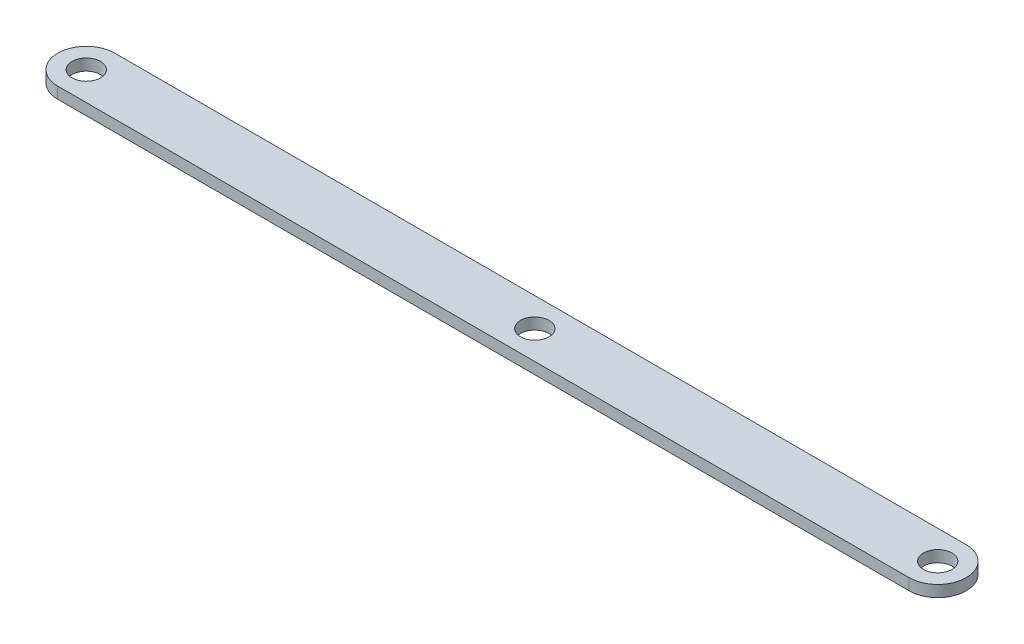
ISO-10303-21;
HEADER;
FILE_DESCRIPTION(('STEP AP214'),'2;1');
FILE_NAME('part.step','',(''),(''),'','','');
FILE_SCHEMA(('AUTOMOTIVE_DESIGN { 1 0 10303 214 1 1 1 1 }'));
ENDSEC;
DATA;
#1=APPLICATION_CONTEXT('core data for automotive mechanical design processes');
#2=APPLICATION_PROTOCOL_DEFINITION('international standard','automotive_design',2000,#1);
#3=PRODUCT_CONTEXT('',#1,'mechanical');
#4=PRODUCT('Part','Part','',(#3));
#5=PRODUCT_RELATED_PRODUCT_CATEGORY('part','',(#4));
#6=PRODUCT_DEFINITION_FORMATION('','',#4);
#7=PRODUCT_DEFINITION_CONTEXT('part definition',#1,'design');
#8=PRODUCT_DEFINITION('design','',#6,#7);
#9=PRODUCT_DEFINITION_SHAPE('','',#8);
#10=(LENGTH_UNIT() NAMED_UNIT(*) SI_UNIT(.MILLI.,.METRE.));
#11=(NAMED_UNIT(*) PLANE_ANGLE_UNIT() SI_UNIT($,.RADIAN.));
#12=(NAMED_UNIT(*) SI_UNIT($,.STERADIAN.) SOLID_ANGLE_UNIT());
#13=UNCERTAINTY_MEASURE_WITH_UNIT(LENGTH_MEASURE(1.E-05),#10,'distance_accuracy_value','');
#14=(GEOMETRIC_REPRESENTATION_CONTEXT(3) GLOBAL_UNCERTAINTY_ASSIGNED_CONTEXT((#13)) GLOBAL_UNIT_ASSIGNED_CONTEXT((#10,
#11,#12)) REPRESENTATION_CONTEXT('',''));
#15=CARTESIAN_POINT('',(0.,0.,0.));
#16=DIRECTION('',(0.,0.,1.));
#17=DIRECTION('',(1.,0.,0.));
#18=AXIS2_PLACEMENT_3D('',#15,#16,#17);
#19=CARTESIAN_POINT('',(0.,5.08,0.));
#20=DIRECTION('',(0.,-1.,0.));
#21=DIRECTION('',(0.,0.,-1.));
#22=AXIS2_PLACEMENT_3D('',#19,#20,#21);
#23=PLANE('',#22);
#24=CARTESIAN_POINT('',(0.,5.08,0.));
#25=DIRECTION('',(0.,1.,0.));
#26=DIRECTION('',(0.,0.,-1.));
#27=AXIS2_PLACEMENT_3D('',#24,#25,#26);
#28=CIRCLE('',#27,12.7);
#29=CARTESIAN_POINT('',(0.,5.08,12.7));
#30=VERTEX_POINT('',#29);
#31=CARTESIAN_POINT('',(0.,5.08,-12.7));
#32=VERTEX_POINT('',#31);
#33=EDGE_CURVE('E94',#30,#32,#28,.T.);
#34=ORIENTED_EDGE('',*,*,#33,.T.);
#35=DIRECTION('',(-1.,0.,0.));
#36=VECTOR('',#35,1.);
#37=CARTESIAN_POINT('',(-378.9,5.08,-12.7));
#38=LINE('',#37,#36);
#39=CARTESIAN_POINT('',(-378.9,5.08,-12.7));
#40=VERTEX_POINT('',#39);
#41=EDGE_CURVE('E89',#32,#40,#38,.T.);
#42=ORIENTED_EDGE('',*,*,#41,.T.);
#43=CARTESIAN_POINT('',(-378.9,5.08,0.));
#44=DIRECTION('',(0.,1.,0.));
#45=DIRECTION('',(0.,0.,1.));
#46=AXIS2_PLACEMENT_3D('',#43,#44,#45);
#47=CIRCLE('',#46,12.7);
#48=CARTESIAN_POINT('',(-378.9,5.08,12.7));
#49=VERTEX_POINT('',#48);
#50=EDGE_CURVE('E92',#40,#49,#47,.T.);
#51=ORIENTED_EDGE('',*,*,#50,.T.);
#52=DIRECTION('',(1.,0.,0.));
#53=VECTOR('',#52,1.);
#54=CARTESIAN_POINT('',(0.,5.08,12.7));
#55=LINE('',#54,#53);
#56=EDGE_CURVE('E59',#49,#30,#55,.T.);
#57=ORIENTED_EDGE('',*,*,#56,.T.);
#58=EDGE_LOOP('',(#34,#42,#51,#57));
#59=FACE_BOUND('',#58,.T.);
#60=CARTESIAN_POINT('',(0.,5.08,0.));
#61=DIRECTION('',(0.,1.,0.));
#62=DIRECTION('',(0.,0.,1.));
#63=AXIS2_PLACEMENT_3D('',#60,#61,#62);
#64=CIRCLE('',#63,6.35);
#65=CARTESIAN_POINT('',(0.,5.08,6.35));
#66=VERTEX_POINT('',#65);
#67=EDGE_CURVE('E109',#66,#66,#64,.T.);
#68=ORIENTED_EDGE('',*,*,#67,.F.);
#69=EDGE_LOOP('',(#68));
#70=FACE_BOUND('',#69,.T.);
#71=CARTESIAN_POINT('',(-179.3,5.08,0.));
#72=DIRECTION('',(0.,1.,0.));
#73=DIRECTION('',(0.,0.,1.));
#74=AXIS2_PLACEMENT_3D('',#71,#72,#73);
#75=CIRCLE('',#74,6.35);
#76=CARTESIAN_POINT('',(-179.3,5.08,6.35000000000002));
#77=VERTEX_POINT('',#76);
#78=EDGE_CURVE('E124',#77,#77,#75,.T.);
#79=ORIENTED_EDGE('',*,*,#78,.F.);
#80=EDGE_LOOP('',(#79));
#81=FACE_BOUND('',#80,.T.);
#82=CARTESIAN_POINT('',(-378.9,5.08,0.));
#83=DIRECTION('',(0.,1.,0.));
#84=DIRECTION('',(0.,0.,1.));
#85=AXIS2_PLACEMENT_3D('',#82,#83,#84);
#86=CIRCLE('',#85,6.35);
#87=CARTESIAN_POINT('',(-378.9,5.08,6.35000000000002));
#88=VERTEX_POINT('',#87);
#89=EDGE_CURVE('E130',#88,#88,#86,.T.);
#90=ORIENTED_EDGE('',*,*,#89,.F.);
#91=EDGE_LOOP('',(#90));
#92=FACE_BOUND('',#91,.T.);
#93=ADVANCED_FACE('F42',(#59,#70,#81,#92),#23,.F.);
#94=CARTESIAN_POINT('',(0.,0.,0.));
#95=DIRECTION('',(0.,-1.,0.));
#96=DIRECTION('',(0.,0.,-1.));
#97=AXIS2_PLACEMENT_3D('',#94,#95,#96);
#98=PLANE('',#97);
#99=CARTESIAN_POINT('',(-179.3,0.,0.));
#100=DIRECTION('',(0.,1.,0.));
#101=DIRECTION('',(0.,0.,1.));
#102=AXIS2_PLACEMENT_3D('',#99,#100,#101);
#103=CIRCLE('',#102,6.35);
#104=CARTESIAN_POINT('',(-179.3,0.,6.35000000000002));
#105=VERTEX_POINT('',#104);
#106=EDGE_CURVE('E127',#105,#105,#103,.T.);
#107=ORIENTED_EDGE('',*,*,#106,.T.);
#108=EDGE_LOOP('',(#107));
#109=FACE_BOUND('',#108,.T.);
#110=CARTESIAN_POINT('',(0.,0.,0.));
#111=DIRECTION('',(0.,1.,0.));
#112=DIRECTION('',(0.,0.,-1.));
#113=AXIS2_PLACEMENT_3D('',#110,#111,#112);
#114=CIRCLE('',#113,12.7);
#115=CARTESIAN_POINT('',(0.,0.,12.7));
#116=VERTEX_POINT('',#115);
#117=CARTESIAN_POINT('',(0.,0.,-12.7));
#118=VERTEX_POINT('',#117);
#119=EDGE_CURVE('E106',#116,#118,#114,.T.);
#120=ORIENTED_EDGE('',*,*,#119,.F.);
#121=DIRECTION('',(1.,0.,0.));
#122=VECTOR('',#121,1.);
#123=CARTESIAN_POINT('',(0.,0.,12.7));
#124=LINE('',#123,#122);
#125=CARTESIAN_POINT('',(-378.9,0.,12.7));
#126=VERTEX_POINT('',#125);
#127=EDGE_CURVE('E82',#126,#116,#124,.T.);
#128=ORIENTED_EDGE('',*,*,#127,.F.);
#129=CARTESIAN_POINT('',(-378.9,0.,0.));
#130=DIRECTION('',(0.,1.,0.));
#131=DIRECTION('',(0.,0.,1.));
#132=AXIS2_PLACEMENT_3D('',#129,#130,#131);
#133=CIRCLE('',#132,12.7);
#134=CARTESIAN_POINT('',(-378.9,0.,-12.7));
#135=VERTEX_POINT('',#134);
#136=EDGE_CURVE('E76',#135,#126,#133,.T.);
#137=ORIENTED_EDGE('',*,*,#136,.F.);
#138=DIRECTION('',(-1.,0.,0.));
#139=VECTOR('',#138,1.);
#140=CARTESIAN_POINT('',(-378.9,0.,-12.7));
#141=LINE('',#140,#139);
#142=EDGE_CURVE('E98',#118,#135,#141,.T.);
#143=ORIENTED_EDGE('',*,*,#142,.F.);
#144=EDGE_LOOP('',(#120,#128,#137,#143));
#145=FACE_BOUND('',#144,.T.);
#146=CARTESIAN_POINT('',(0.,0.,0.));
#147=DIRECTION('',(0.,1.,0.));
#148=DIRECTION('',(0.,0.,1.));
#149=AXIS2_PLACEMENT_3D('',#146,#147,#148);
#150=CIRCLE('',#149,6.35);
#151=CARTESIAN_POINT('',(0.,0.,6.35));
#152=VERTEX_POINT('',#151);
#153=EDGE_CURVE('E121',#152,#152,#150,.T.);
#154=ORIENTED_EDGE('',*,*,#153,.T.);
#155=EDGE_LOOP('',(#154));
#156=FACE_BOUND('',#155,.T.);
#157=CARTESIAN_POINT('',(-378.9,0.,0.));
#158=DIRECTION('',(0.,1.,0.));
#159=DIRECTION('',(0.,0.,1.));
#160=AXIS2_PLACEMENT_3D('',#157,#158,#159);
#161=CIRCLE('',#160,6.35);
#162=CARTESIAN_POINT('',(-378.9,0.,6.35000000000002));
#163=VERTEX_POINT('',#162);
#164=EDGE_CURVE('E133',#163,#163,#161,.T.);
#165=ORIENTED_EDGE('',*,*,#164,.T.);
#166=EDGE_LOOP('',(#165));
#167=FACE_BOUND('',#166,.T.);
#168=ADVANCED_FACE('F117',(#109,#145,#156,#167),#98,.T.);
#169=CARTESIAN_POINT('',(0.,5.08,0.));
#170=DIRECTION('',(0.,-1.,0.));
#171=DIRECTION('',(0.,0.,-1.));
#172=AXIS2_PLACEMENT_3D('',#169,#170,#171);
#173=CYLINDRICAL_SURFACE('',#172,12.7);
#174=ORIENTED_EDGE('',*,*,#119,.T.);
#175=DIRECTION('',(0.,-1.,0.));
#176=VECTOR('',#175,1.);
#177=CARTESIAN_POINT('',(0.,5.08,-12.7));
#178=LINE('',#177,#176);
#179=EDGE_CURVE('E11',#32,#118,#178,.T.);
#180=ORIENTED_EDGE('',*,*,#179,.F.);
#181=ORIENTED_EDGE('',*,*,#33,.F.);
#182=DIRECTION('',(0.,-1.,0.));
#183=VECTOR('',#182,1.);
#184=CARTESIAN_POINT('',(0.,5.08,12.7));
#185=LINE('',#184,#183);
#186=EDGE_CURVE('E102',#30,#116,#185,.T.);
#187=ORIENTED_EDGE('',*,*,#186,.T.);
#188=EDGE_LOOP('',(#174,#180,#181,#187));
#189=FACE_BOUND('',#188,.T.);
#190=ADVANCED_FACE('F44',(#189),#173,.T.);
#191=CARTESIAN_POINT('',(-378.9,5.08,-12.7));
#192=DIRECTION('',(0.,0.,1.));
#193=DIRECTION('',(1.,0.,0.));
#194=AXIS2_PLACEMENT_3D('',#191,#192,#193);
#195=PLANE('',#194);
#196=ORIENTED_EDGE('',*,*,#142,.T.);
#197=DIRECTION('',(0.,-1.,0.));
#198=VECTOR('',#197,1.);
#199=CARTESIAN_POINT('',(-378.9,5.08,-12.7));
#200=LINE('',#199,#198);
#201=EDGE_CURVE('E51',#40,#135,#200,.T.);
#202=ORIENTED_EDGE('',*,*,#201,.F.);
#203=ORIENTED_EDGE('',*,*,#41,.F.);
#204=ORIENTED_EDGE('',*,*,#179,.T.);
#205=EDGE_LOOP('',(#196,#202,#203,#204));
#206=FACE_BOUND('',#205,.T.);
#207=ADVANCED_FACE('F97',(#206),#195,.F.);
#208=CARTESIAN_POINT('',(-378.9,5.08,0.));
#209=DIRECTION('',(0.,-1.,0.));
#210=DIRECTION('',(0.,0.,-1.));
#211=AXIS2_PLACEMENT_3D('',#208,#209,#210);
#212=CYLINDRICAL_SURFACE('',#211,12.7);
#213=ORIENTED_EDGE('',*,*,#136,.T.);
#214=DIRECTION('',(0.,-1.,0.));
#215=VECTOR('',#214,1.);
#216=CARTESIAN_POINT('',(-378.9,5.08,12.7));
#217=LINE('',#216,#215);
#218=EDGE_CURVE('E99',#49,#126,#217,.T.);
#219=ORIENTED_EDGE('',*,*,#218,.F.);
#220=ORIENTED_EDGE('',*,*,#50,.F.);
#221=ORIENTED_EDGE('',*,*,#201,.T.);
#222=EDGE_LOOP('',(#213,#219,#220,#221));
#223=FACE_BOUND('',#222,.T.);
#224=ADVANCED_FACE('F100',(#223),#212,.T.);
#225=CARTESIAN_POINT('',(0.,5.08,12.7));
#226=DIRECTION('',(0.,0.,-1.));
#227=DIRECTION('',(-1.,0.,0.));
#228=AXIS2_PLACEMENT_3D('',#225,#226,#227);
#229=PLANE('',#228);
#230=ORIENTED_EDGE('',*,*,#127,.T.);
#231=ORIENTED_EDGE('',*,*,#186,.F.);
#232=ORIENTED_EDGE('',*,*,#56,.F.);
#233=ORIENTED_EDGE('',*,*,#218,.T.);
#234=EDGE_LOOP('',(#230,#231,#232,#233));
#235=FACE_BOUND('',#234,.T.);
#236=ADVANCED_FACE('F114',(#235),#229,.F.);
#237=CARTESIAN_POINT('',(0.,5.08,0.));
#238=DIRECTION('',(0.,-1.,0.));
#239=DIRECTION('',(0.,0.,-1.));
#240=AXIS2_PLACEMENT_3D('',#237,#238,#239);
#241=CYLINDRICAL_SURFACE('',#240,6.35);
#242=ORIENTED_EDGE('',*,*,#67,.T.);
#243=EDGE_LOOP('',(#242));
#244=FACE_BOUND('',#243,.T.);
#245=ORIENTED_EDGE('',*,*,#153,.F.);
#246=EDGE_LOOP('',(#245));
#247=FACE_BOUND('',#246,.T.);
#248=ADVANCED_FACE('F150',(#244,#247),#241,.F.);
#249=CARTESIAN_POINT('',(-179.3,5.08,0.));
#250=DIRECTION('',(0.,-1.,0.));
#251=DIRECTION('',(0.,0.,-1.));
#252=AXIS2_PLACEMENT_3D('',#249,#250,#251);
#253=CYLINDRICAL_SURFACE('',#252,6.35);
#254=ORIENTED_EDGE('',*,*,#78,.T.);
#255=EDGE_LOOP('',(#254));
#256=FACE_BOUND('',#255,.T.);
#257=ORIENTED_EDGE('',*,*,#106,.F.);
#258=EDGE_LOOP('',(#257));
#259=FACE_BOUND('',#258,.T.);
#260=ADVANCED_FACE('F195',(#256,#259),#253,.F.);
#261=CARTESIAN_POINT('',(-378.9,5.08,0.));
#262=DIRECTION('',(0.,-1.,0.));
#263=DIRECTION('',(0.,0.,-1.));
#264=AXIS2_PLACEMENT_3D('',#261,#262,#263);
#265=CYLINDRICAL_SURFACE('',#264,6.35);
#266=ORIENTED_EDGE('',*,*,#89,.T.);
#267=EDGE_LOOP('',(#266));
#268=FACE_BOUND('',#267,.T.);
#269=ORIENTED_EDGE('',*,*,#164,.F.);
#270=EDGE_LOOP('',(#269));
#271=FACE_BOUND('',#270,.T.);
#272=ADVANCED_FACE('F139',(#268,#271),#265,.F.);
#273=CLOSED_SHELL('',(#93,#168,#190,#207,#224,#236,#248,#260,#272));
#274=MANIFOLD_SOLID_BREP('B2',#273);
#275=ADVANCED_BREP_SHAPE_REPRESENTATION('',(#18,#274),#14);
#276=SHAPE_DEFINITION_REPRESENTATION(#9,#275);
ENDSEC;
END-ISO-10303-21;
